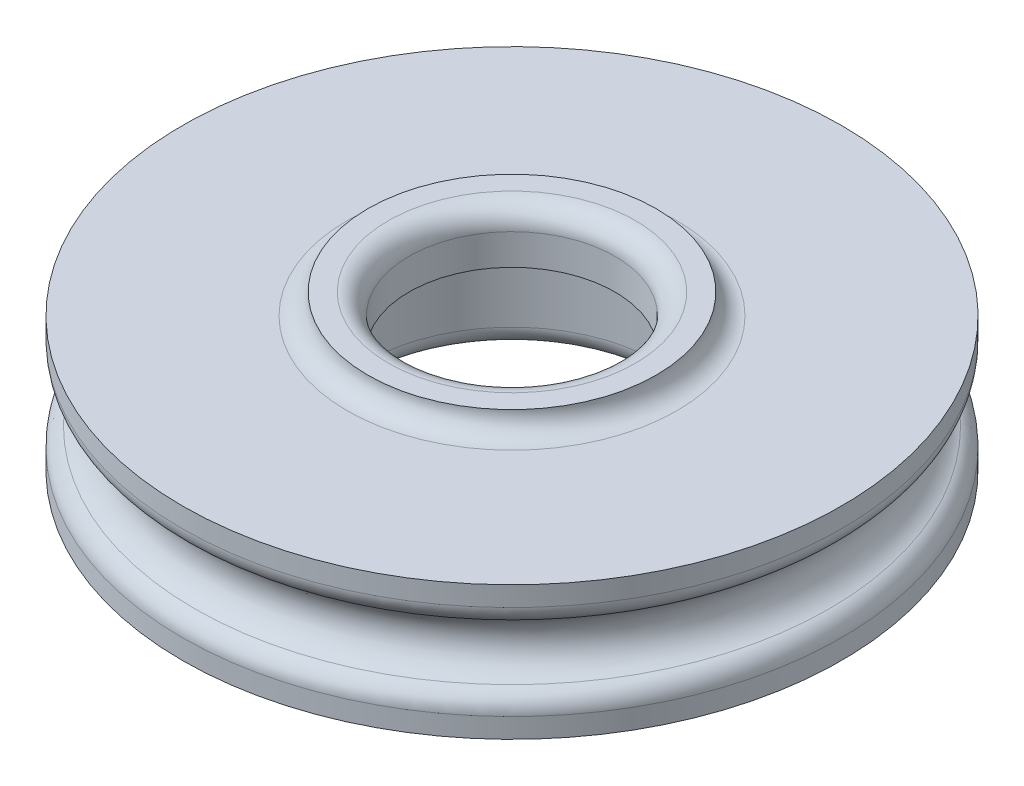
ISO-10303-21;
HEADER;
FILE_DESCRIPTION(('STEP AP214'),'2;1');
FILE_NAME('part.step','',(''),(''),'','','');
FILE_SCHEMA(('AUTOMOTIVE_DESIGN { 1 0 10303 214 1 1 1 1 }'));
ENDSEC;
DATA;
#1=APPLICATION_CONTEXT('core data for automotive mechanical design processes');
#2=APPLICATION_PROTOCOL_DEFINITION('international standard','automotive_design',2000,#1);
#3=PRODUCT_CONTEXT('',#1,'mechanical');
#4=PRODUCT('Part','Part','',(#3));
#5=PRODUCT_RELATED_PRODUCT_CATEGORY('part','',(#4));
#6=PRODUCT_DEFINITION_FORMATION('','',#4);
#7=PRODUCT_DEFINITION_CONTEXT('part definition',#1,'design');
#8=PRODUCT_DEFINITION('design','',#6,#7);
#9=PRODUCT_DEFINITION_SHAPE('','',#8);
#10=(LENGTH_UNIT() NAMED_UNIT(*) SI_UNIT(.MILLI.,.METRE.));
#11=(NAMED_UNIT(*) PLANE_ANGLE_UNIT() SI_UNIT($,.RADIAN.));
#12=(NAMED_UNIT(*) SI_UNIT($,.STERADIAN.) SOLID_ANGLE_UNIT());
#13=UNCERTAINTY_MEASURE_WITH_UNIT(LENGTH_MEASURE(1.E-05),#10,'distance_accuracy_value','');
#14=(GEOMETRIC_REPRESENTATION_CONTEXT(3) GLOBAL_UNCERTAINTY_ASSIGNED_CONTEXT((#13)) GLOBAL_UNIT_ASSIGNED_CONTEXT((#10,
#11,#12)) REPRESENTATION_CONTEXT('',''));
#15=CARTESIAN_POINT('',(0.,0.,0.));
#16=DIRECTION('',(0.,0.,1.));
#17=DIRECTION('',(1.,0.,0.));
#18=AXIS2_PLACEMENT_3D('',#15,#16,#17);
#19=CARTESIAN_POINT('',(0.,1.625,0.));
#20=DIRECTION('',(0.,1.,0.));
#21=DIRECTION('',(0.,0.,1.));
#22=AXIS2_PLACEMENT_3D('',#19,#20,#21);
#23=PLANE('',#22);
#24=CARTESIAN_POINT('',(0.,1.625,0.));
#25=DIRECTION('',(0.,1.,0.));
#26=DIRECTION('',(0.,0.,1.));
#27=AXIS2_PLACEMENT_3D('',#24,#25,#26);
#28=CIRCLE('',#27,4.);
#29=CARTESIAN_POINT('',(0.,1.625,4.));
#30=VERTEX_POINT('',#29);
#31=EDGE_CURVE('E10',#30,#30,#28,.F.);
#32=ORIENTED_EDGE('',*,*,#31,.T.);
#33=EDGE_LOOP('',(#32));
#34=FACE_BOUND('',#33,.T.);
#35=CARTESIAN_POINT('',(0.,1.625,0.));
#36=DIRECTION('',(0.,1.,0.));
#37=DIRECTION('',(0.,0.,1.));
#38=AXIS2_PLACEMENT_3D('',#35,#36,#37);
#39=CIRCLE('',#38,8.);
#40=CARTESIAN_POINT('',(0.,1.625,-8.));
#41=VERTEX_POINT('',#40);
#42=EDGE_CURVE('E77',#41,#41,#39,.T.);
#43=ORIENTED_EDGE('',*,*,#42,.T.);
#44=EDGE_LOOP('',(#43));
#45=FACE_BOUND('',#44,.T.);
#46=ADVANCED_FACE('F36',(#34,#45),#23,.T.);
#47=CARTESIAN_POINT('',(0.,1.625,0.));
#48=DIRECTION('',(0.,-1.,0.));
#49=DIRECTION('',(0.,0.,-1.));
#50=AXIS2_PLACEMENT_3D('',#47,#48,#49);
#51=CYLINDRICAL_SURFACE('',#50,3.55);
#52=CARTESIAN_POINT('',(0.,0.375,0.));
#53=DIRECTION('',(0.,1.,0.));
#54=DIRECTION('',(0.,0.,1.));
#55=AXIS2_PLACEMENT_3D('',#52,#53,#54);
#56=CIRCLE('',#55,3.55);
#57=CARTESIAN_POINT('',(0.,0.375,-3.55));
#58=VERTEX_POINT('',#57);
#59=EDGE_CURVE('E71',#58,#58,#56,.T.);
#60=CARTESIAN_POINT('',(0.,-1.125,0.));
#61=DIRECTION('',(0.,1.,0.));
#62=DIRECTION('',(0.,0.,1.));
#63=AXIS2_PLACEMENT_3D('',#60,#61,#62);
#64=CIRCLE('',#63,3.55);
#65=CARTESIAN_POINT('',(0.,-1.125,-3.55));
#66=VERTEX_POINT('',#65);
#67=EDGE_CURVE('E74',#66,#66,#64,.F.);
#68=CARTESIAN_POINT('',(0.,0.375,-3.55));
#69=CARTESIAN_POINT('',(0.,0.359375,-3.55));
#70=CARTESIAN_POINT('',(0.,0.34375,-3.55));
#71=CARTESIAN_POINT('',(0.,0.3125,-3.55));
#72=CARTESIAN_POINT('',(0.,0.296875,-3.55));
#73=CARTESIAN_POINT('',(0.,0.265625,-3.55));
#74=CARTESIAN_POINT('',(0.,0.25,-3.55));
#75=CARTESIAN_POINT('',(0.,0.21875,-3.55));
#76=CARTESIAN_POINT('',(0.,0.203125,-3.55));
#77=CARTESIAN_POINT('',(0.,0.171875,-3.55));
#78=CARTESIAN_POINT('',(0.,0.15625,-3.55));
#79=CARTESIAN_POINT('',(0.,0.125,-3.55));
#80=CARTESIAN_POINT('',(0.,0.109375,-3.55));
#81=CARTESIAN_POINT('',(0.,0.0781249999999998,-3.55));
#82=CARTESIAN_POINT('',(0.,0.0624999999999998,-3.55));
#83=CARTESIAN_POINT('',(0.,0.0312499999999998,-3.55));
#84=CARTESIAN_POINT('',(0.,0.0156249999999998,-3.55));
#85=CARTESIAN_POINT('',(0.,-0.0156250000000002,-3.55));
#86=CARTESIAN_POINT('',(0.,-0.0312500000000002,-3.55));
#87=CARTESIAN_POINT('',(0.,-0.0625000000000003,-3.55));
#88=CARTESIAN_POINT('',(0.,-0.0781250000000003,-3.55));
#89=CARTESIAN_POINT('',(0.,-0.109375,-3.55));
#90=CARTESIAN_POINT('',(0.,-0.125,-3.55));
#91=CARTESIAN_POINT('',(0.,-0.15625,-3.55));
#92=CARTESIAN_POINT('',(0.,-0.171875,-3.55));
#93=CARTESIAN_POINT('',(0.,-0.203125,-3.55));
#94=CARTESIAN_POINT('',(0.,-0.21875,-3.55));
#95=CARTESIAN_POINT('',(0.,-0.25,-3.55));
#96=CARTESIAN_POINT('',(0.,-0.265625,-3.55));
#97=CARTESIAN_POINT('',(0.,-0.296875,-3.55));
#98=CARTESIAN_POINT('',(0.,-0.3125,-3.55));
#99=CARTESIAN_POINT('',(0.,-0.34375,-3.55));
#100=CARTESIAN_POINT('',(0.,-0.359375,-3.55));
#101=CARTESIAN_POINT('',(0.,-0.390625,-3.55));
#102=CARTESIAN_POINT('',(0.,-0.40625,-3.55));
#103=CARTESIAN_POINT('',(0.,-0.4375,-3.55));
#104=CARTESIAN_POINT('',(0.,-0.453125,-3.55));
#105=CARTESIAN_POINT('',(0.,-0.484375,-3.55));
#106=CARTESIAN_POINT('',(0.,-0.5,-3.55));
#107=CARTESIAN_POINT('',(0.,-0.53125,-3.55));
#108=CARTESIAN_POINT('',(0.,-0.546875,-3.55));
#109=CARTESIAN_POINT('',(0.,-0.578125,-3.55));
#110=CARTESIAN_POINT('',(0.,-0.59375,-3.55));
#111=CARTESIAN_POINT('',(0.,-0.625,-3.55));
#112=CARTESIAN_POINT('',(0.,-0.640625,-3.55));
#113=CARTESIAN_POINT('',(0.,-0.671875,-3.55));
#114=CARTESIAN_POINT('',(0.,-0.6875,-3.55));
#115=CARTESIAN_POINT('',(0.,-0.71875,-3.55));
#116=CARTESIAN_POINT('',(0.,-0.734375,-3.55));
#117=CARTESIAN_POINT('',(0.,-0.765625,-3.55));
#118=CARTESIAN_POINT('',(0.,-0.78125,-3.55));
#119=CARTESIAN_POINT('',(0.,-0.8125,-3.55));
#120=CARTESIAN_POINT('',(0.,-0.828125,-3.55));
#121=CARTESIAN_POINT('',(0.,-0.859375,-3.55));
#122=CARTESIAN_POINT('',(0.,-0.875,-3.55));
#123=CARTESIAN_POINT('',(0.,-0.90625,-3.55));
#124=CARTESIAN_POINT('',(0.,-0.921875,-3.55));
#125=CARTESIAN_POINT('',(0.,-0.953125,-3.55));
#126=CARTESIAN_POINT('',(0.,-0.96875,-3.55));
#127=CARTESIAN_POINT('',(0.,-1.,-3.55));
#128=CARTESIAN_POINT('',(0.,-1.015625,-3.55));
#129=CARTESIAN_POINT('',(0.,-1.046875,-3.55));
#130=CARTESIAN_POINT('',(0.,-1.0625,-3.55));
#131=CARTESIAN_POINT('',(0.,-1.09375,-3.55));
#132=CARTESIAN_POINT('',(0.,-1.109375,-3.55));
#133=CARTESIAN_POINT('',(0.,-1.125,-3.55));
#134=B_SPLINE_CURVE_WITH_KNOTS('',3,(#68,#69,#70,#71,#72,#73,#74,#75,#76,#77,#78,#79,#80,#81,
#82,#83,#84,#85,#86,#87,#88,#89,#90,#91,#92,#93,#94,#95,#96,#97,#98,#99,#100,#101,#102,#103,
#104,#105,#106,#107,#108,#109,#110,#111,#112,#113,#114,#115,#116,#117,#118,#119,#120,#121,#122,
#123,#124,#125,#126,#127,#128,#129,#130,#131,#132,#133),.UNSPECIFIED.,.F.,.F.,(4,2,2,2,2,2,2,2,
2,2,2,2,2,2,2,2,2,2,2,2,2,2,2,2,2,2,2,2,2,2,2,2,4),(0.,0.046875,0.0937500000000001,0.140625,
0.1875,0.234375,0.28125,0.328125,0.375,0.421875,0.46875,0.515625,0.5625,0.609375,0.65625,
0.703125,0.75,0.796875,0.84375,0.890625,0.9375,0.984375,1.03125,1.078125,1.125,1.171875,1.21875,
1.265625,1.3125,1.359375,1.40625,1.453125,1.5),.UNSPECIFIED.);
#135=EDGE_CURVE('BSEAM96',#58,#66,#134,.T.);
#136=ORIENTED_EDGE('',*,*,#59,.T.);
#137=ORIENTED_EDGE('',*,*,#67,.T.);
#138=ORIENTED_EDGE('',*,*,#135,.T.);
#139=ORIENTED_EDGE('',*,*,#135,.F.);
#140=EDGE_LOOP('',(#136,#138,#137,#139));
#141=FACE_BOUND('',#140,.T.);
#142=ADVANCED_FACE('F96',(#141),#51,.F.);
#143=CARTESIAN_POINT('',(0.,1.625,0.));
#144=DIRECTION('',(0.,-1.,0.));
#145=DIRECTION('',(0.,0.,-1.));
#146=AXIS2_PLACEMENT_3D('',#143,#144,#145);
#147=CYLINDRICAL_SURFACE('',#146,8.);
#148=CARTESIAN_POINT('',(0.,1.14564392373896,0.));
#149=DIRECTION('',(0.,-1.,0.));
#150=DIRECTION('',(0.,0.,-1.));
#151=AXIS2_PLACEMENT_3D('',#148,#149,#150);
#152=CIRCLE('',#151,8.);
#153=CARTESIAN_POINT('',(0.,1.14564392373896,-8.));
#154=VERTEX_POINT('',#153);
#155=EDGE_CURVE('E56',#154,#154,#152,.F.);
#156=CARTESIAN_POINT('',(0.,1.14564392373896,-8.));
#157=CARTESIAN_POINT('',(0.,1.15063721620001,-8.));
#158=CARTESIAN_POINT('',(0.,1.15563050866107,-8.));
#159=CARTESIAN_POINT('',(0.,1.16561709358317,-8.));
#160=CARTESIAN_POINT('',(0.,1.17061038604422,-8.));
#161=CARTESIAN_POINT('',(0.,1.18059697096633,-8.));
#162=CARTESIAN_POINT('',(0.,1.18559026342738,-8.));
#163=CARTESIAN_POINT('',(0.,1.19557684834949,-8.));
#164=CARTESIAN_POINT('',(0.,1.20057014081054,-8.));
#165=CARTESIAN_POINT('',(0.,1.21055672573264,-8.));
#166=CARTESIAN_POINT('',(0.,1.2155500181937,-8.));
#167=CARTESIAN_POINT('',(0.,1.2255366031158,-8.));
#168=CARTESIAN_POINT('',(0.,1.23052989557685,-8.));
#169=CARTESIAN_POINT('',(0.,1.24051648049896,-8.));
#170=CARTESIAN_POINT('',(0.,1.24550977296001,-8.));
#171=CARTESIAN_POINT('',(0.,1.25549635788212,-8.));
#172=CARTESIAN_POINT('',(0.,1.26048965034317,-8.));
#173=CARTESIAN_POINT('',(0.,1.27047623526527,-8.));
#174=CARTESIAN_POINT('',(0.,1.27546952772633,-8.));
#175=CARTESIAN_POINT('',(0.,1.28545611264843,-8.));
#176=CARTESIAN_POINT('',(0.,1.29044940510948,-8.));
#177=CARTESIAN_POINT('',(0.,1.30043599003159,-8.));
#178=CARTESIAN_POINT('',(0.,1.30542928249264,-8.));
#179=CARTESIAN_POINT('',(0.,1.31541586741475,-8.));
#180=CARTESIAN_POINT('',(0.,1.3204091598758,-8.));
#181=CARTESIAN_POINT('',(0.,1.3303957447979,-8.));
#182=CARTESIAN_POINT('',(0.,1.33538903725896,-8.));
#183=CARTESIAN_POINT('',(0.,1.34537562218106,-8.));
#184=CARTESIAN_POINT('',(0.,1.35036891464211,-8.));
#185=CARTESIAN_POINT('',(0.,1.36035549956422,-8.));
#186=CARTESIAN_POINT('',(0.,1.36534879202527,-8.));
#187=CARTESIAN_POINT('',(0.,1.37533537694738,-8.));
#188=CARTESIAN_POINT('',(0.,1.38032866940843,-8.));
#189=CARTESIAN_POINT('',(0.,1.39031525433053,-8.));
#190=CARTESIAN_POINT('',(0.,1.39530854679159,-8.));
#191=CARTESIAN_POINT('',(0.,1.40529513171369,-8.));
#192=CARTESIAN_POINT('',(0.,1.41028842417474,-8.));
#193=CARTESIAN_POINT('',(0.,1.42027500909685,-8.));
#194=CARTESIAN_POINT('',(0.,1.4252683015579,-8.));
#195=CARTESIAN_POINT('',(0.,1.43525488648001,-8.));
#196=CARTESIAN_POINT('',(0.,1.44024817894106,-8.));
#197=CARTESIAN_POINT('',(0.,1.45023476386316,-8.));
#198=CARTESIAN_POINT('',(0.,1.45522805632422,-8.));
#199=CARTESIAN_POINT('',(0.,1.46521464124632,-8.));
#200=CARTESIAN_POINT('',(0.,1.47020793370737,-8.));
#201=CARTESIAN_POINT('',(0.,1.48019451862948,-8.));
#202=CARTESIAN_POINT('',(0.,1.48518781109053,-8.));
#203=CARTESIAN_POINT('',(0.,1.49517439601264,-8.));
#204=CARTESIAN_POINT('',(0.,1.50016768847369,-8.));
#205=CARTESIAN_POINT('',(0.,1.51015427339579,-8.));
#206=CARTESIAN_POINT('',(0.,1.51514756585685,-8.));
#207=CARTESIAN_POINT('',(0.,1.52513415077895,-8.));
#208=CARTESIAN_POINT('',(0.,1.53012744324,-8.));
#209=CARTESIAN_POINT('',(0.,1.54011402816211,-8.));
#210=CARTESIAN_POINT('',(0.,1.54510732062316,-8.));
#211=CARTESIAN_POINT('',(0.,1.55509390554527,-8.));
#212=CARTESIAN_POINT('',(0.,1.56008719800632,-8.));
#213=CARTESIAN_POINT('',(0.,1.57007378292842,-8.));
#214=CARTESIAN_POINT('',(0.,1.57506707538947,-8.));
#215=CARTESIAN_POINT('',(0.,1.58505366031158,-8.));
#216=CARTESIAN_POINT('',(0.,1.59004695277263,-8.));
#217=CARTESIAN_POINT('',(0.,1.60003353769474,-8.));
#218=CARTESIAN_POINT('',(0.,1.60502683015579,-8.));
#219=CARTESIAN_POINT('',(0.,1.61501341507789,-8.));
#220=CARTESIAN_POINT('',(0.,1.62000670753895,-8.));
#221=CARTESIAN_POINT('',(0.,1.625,-8.));
#222=B_SPLINE_CURVE_WITH_KNOTS('',3,(#156,#157,#158,#159,#160,#161,#162,#163,#164,#165,#166,
#167,#168,#169,#170,#171,#172,#173,#174,#175,#176,#177,#178,#179,#180,#181,#182,#183,#184,#185,
#186,#187,#188,#189,#190,#191,#192,#193,#194,#195,#196,#197,#198,#199,#200,#201,#202,#203,#204,
#205,#206,#207,#208,#209,#210,#211,#212,#213,#214,#215,#216,#217,#218,#219,#220,#221),
.UNSPECIFIED.,.F.,.F.,(4,2,2,2,2,2,2,2,2,2,2,2,2,2,2,2,2,2,2,2,2,2,2,2,2,2,2,2,2,2,2,2,4),(0.,
0.0149798773831573,0.0299597547663147,0.0449396321494722,0.0599195095326297,0.0748993869157872,
0.0898792642989447,0.104859141682102,0.119839019065259,0.134818896448417,0.149798773831574,
0.164778651214732,0.179758528597889,0.194738405981047,0.209718283364204,0.224698160747362,
0.239678038130519,0.254657915513676,0.269637792896834,0.284617670279991,0.299597547663149,
0.314577425046306,0.329557302429464,0.344537179812621,0.359517057195778,0.374496934578936,
0.389476811962093,0.404456689345251,0.419436566728408,0.434416444111566,0.449396321494723,
0.464376198877881,0.479356076261038),.UNSPECIFIED.);
#223=EDGE_CURVE('BSEAM99',#154,#41,#222,.T.);
#224=ORIENTED_EDGE('',*,*,#155,.T.);
#225=ORIENTED_EDGE('',*,*,#42,.F.);
#226=ORIENTED_EDGE('',*,*,#223,.T.);
#227=ORIENTED_EDGE('',*,*,#223,.F.);
#228=EDGE_LOOP('',(#224,#226,#225,#227));
#229=FACE_BOUND('',#228,.T.);
#230=ADVANCED_FACE('F99',(#229),#147,.T.);
#231=CARTESIAN_POINT('',(0.,-1.625,0.));
#232=DIRECTION('',(0.,1.,0.));
#233=DIRECTION('',(0.,0.,1.));
#234=AXIS2_PLACEMENT_3D('',#231,#232,#233);
#235=PLANE('',#234);
#236=CARTESIAN_POINT('',(0.,-1.625,0.));
#237=DIRECTION('',(0.,1.,0.));
#238=DIRECTION('',(0.,0.,1.));
#239=AXIS2_PLACEMENT_3D('',#236,#237,#238);
#240=CIRCLE('',#239,4.05);
#241=CARTESIAN_POINT('',(0.,-1.625,4.05));
#242=VERTEX_POINT('',#241);
#243=EDGE_CURVE('E65',#242,#242,#240,.T.);
#244=ORIENTED_EDGE('',*,*,#243,.T.);
#245=EDGE_LOOP('',(#244));
#246=FACE_BOUND('',#245,.T.);
#247=CARTESIAN_POINT('',(0.,-1.625,0.));
#248=DIRECTION('',(0.,1.,0.));
#249=DIRECTION('',(0.,0.,1.));
#250=AXIS2_PLACEMENT_3D('',#247,#248,#249);
#251=CIRCLE('',#250,8.);
#252=CARTESIAN_POINT('',(0.,-1.625,-8.));
#253=VERTEX_POINT('',#252);
#254=EDGE_CURVE('E78',#253,#253,#251,.T.);
#255=ORIENTED_EDGE('',*,*,#254,.F.);
#256=EDGE_LOOP('',(#255));
#257=FACE_BOUND('',#256,.T.);
#258=ADVANCED_FACE('F103',(#246,#257),#235,.F.);
#259=CARTESIAN_POINT('',(0.,-1.14564392373896,0.));
#260=DIRECTION('',(0.,-1.,0.));
#261=DIRECTION('',(0.,0.,-1.));
#262=AXIS2_PLACEMENT_3D('',#259,#260,#261);
#263=CIRCLE('',#262,8.);
#264=CARTESIAN_POINT('',(0.,-1.14564392373896,-8.));
#265=VERTEX_POINT('',#264);
#266=EDGE_CURVE('E43',#265,#265,#263,.T.);
#267=CARTESIAN_POINT('',(0.,-1.14564392373896,-8.));
#268=CARTESIAN_POINT('',(0.,-1.15063721620001,-8.));
#269=CARTESIAN_POINT('',(0.,-1.15563050866107,-8.));
#270=CARTESIAN_POINT('',(0.,-1.16561709358317,-8.));
#271=CARTESIAN_POINT('',(0.,-1.17061038604422,-8.));
#272=CARTESIAN_POINT('',(0.,-1.18059697096633,-8.));
#273=CARTESIAN_POINT('',(0.,-1.18559026342738,-8.));
#274=CARTESIAN_POINT('',(0.,-1.19557684834949,-8.));
#275=CARTESIAN_POINT('',(0.,-1.20057014081054,-8.));
#276=CARTESIAN_POINT('',(0.,-1.21055672573264,-8.));
#277=CARTESIAN_POINT('',(0.,-1.2155500181937,-8.));
#278=CARTESIAN_POINT('',(0.,-1.2255366031158,-8.));
#279=CARTESIAN_POINT('',(0.,-1.23052989557685,-8.));
#280=CARTESIAN_POINT('',(0.,-1.24051648049896,-8.));
#281=CARTESIAN_POINT('',(0.,-1.24550977296001,-8.));
#282=CARTESIAN_POINT('',(0.,-1.25549635788212,-8.));
#283=CARTESIAN_POINT('',(0.,-1.26048965034317,-8.));
#284=CARTESIAN_POINT('',(0.,-1.27047623526527,-8.));
#285=CARTESIAN_POINT('',(0.,-1.27546952772633,-8.));
#286=CARTESIAN_POINT('',(0.,-1.28545611264843,-8.));
#287=CARTESIAN_POINT('',(0.,-1.29044940510948,-8.));
#288=CARTESIAN_POINT('',(0.,-1.30043599003159,-8.));
#289=CARTESIAN_POINT('',(0.,-1.30542928249264,-8.));
#290=CARTESIAN_POINT('',(0.,-1.31541586741475,-8.));
#291=CARTESIAN_POINT('',(0.,-1.3204091598758,-8.));
#292=CARTESIAN_POINT('',(0.,-1.3303957447979,-8.));
#293=CARTESIAN_POINT('',(0.,-1.33538903725896,-8.));
#294=CARTESIAN_POINT('',(0.,-1.34537562218106,-8.));
#295=CARTESIAN_POINT('',(0.,-1.35036891464211,-8.));
#296=CARTESIAN_POINT('',(0.,-1.36035549956422,-8.));
#297=CARTESIAN_POINT('',(0.,-1.36534879202527,-8.));
#298=CARTESIAN_POINT('',(0.,-1.37533537694738,-8.));
#299=CARTESIAN_POINT('',(0.,-1.38032866940843,-8.));
#300=CARTESIAN_POINT('',(0.,-1.39031525433053,-8.));
#301=CARTESIAN_POINT('',(0.,-1.39530854679159,-8.));
#302=CARTESIAN_POINT('',(0.,-1.40529513171369,-8.));
#303=CARTESIAN_POINT('',(0.,-1.41028842417474,-8.));
#304=CARTESIAN_POINT('',(0.,-1.42027500909685,-8.));
#305=CARTESIAN_POINT('',(0.,-1.4252683015579,-8.));
#306=CARTESIAN_POINT('',(0.,-1.43525488648001,-8.));
#307=CARTESIAN_POINT('',(0.,-1.44024817894106,-8.));
#308=CARTESIAN_POINT('',(0.,-1.45023476386316,-8.));
#309=CARTESIAN_POINT('',(0.,-1.45522805632422,-8.));
#310=CARTESIAN_POINT('',(0.,-1.46521464124632,-8.));
#311=CARTESIAN_POINT('',(0.,-1.47020793370737,-8.));
#312=CARTESIAN_POINT('',(0.,-1.48019451862948,-8.));
#313=CARTESIAN_POINT('',(0.,-1.48518781109053,-8.));
#314=CARTESIAN_POINT('',(0.,-1.49517439601264,-8.));
#315=CARTESIAN_POINT('',(0.,-1.50016768847369,-8.));
#316=CARTESIAN_POINT('',(0.,-1.51015427339579,-8.));
#317=CARTESIAN_POINT('',(0.,-1.51514756585684,-8.));
#318=CARTESIAN_POINT('',(0.,-1.52513415077895,-8.));
#319=CARTESIAN_POINT('',(0.,-1.53012744324,-8.));
#320=CARTESIAN_POINT('',(0.,-1.54011402816211,-8.));
#321=CARTESIAN_POINT('',(0.,-1.54510732062316,-8.));
#322=CARTESIAN_POINT('',(0.,-1.55509390554527,-8.));
#323=CARTESIAN_POINT('',(0.,-1.56008719800632,-8.));
#324=CARTESIAN_POINT('',(0.,-1.57007378292842,-8.));
#325=CARTESIAN_POINT('',(0.,-1.57506707538947,-8.));
#326=CARTESIAN_POINT('',(0.,-1.58505366031158,-8.));
#327=CARTESIAN_POINT('',(0.,-1.59004695277263,-8.));
#328=CARTESIAN_POINT('',(0.,-1.60003353769474,-8.));
#329=CARTESIAN_POINT('',(0.,-1.60502683015579,-8.));
#330=CARTESIAN_POINT('',(0.,-1.61501341507789,-8.));
#331=CARTESIAN_POINT('',(0.,-1.62000670753895,-8.));
#332=CARTESIAN_POINT('',(0.,-1.625,-8.));
#333=B_SPLINE_CURVE_WITH_KNOTS('',3,(#267,#268,#269,#270,#271,#272,#273,#274,#275,#276,#277,
#278,#279,#280,#281,#282,#283,#284,#285,#286,#287,#288,#289,#290,#291,#292,#293,#294,#295,#296,
#297,#298,#299,#300,#301,#302,#303,#304,#305,#306,#307,#308,#309,#310,#311,#312,#313,#314,#315,
#316,#317,#318,#319,#320,#321,#322,#323,#324,#325,#326,#327,#328,#329,#330,#331,#332),
.UNSPECIFIED.,.F.,.F.,(4,2,2,2,2,2,2,2,2,2,2,2,2,2,2,2,2,2,2,2,2,2,2,2,2,2,2,2,2,2,2,2,4),(0.,
0.0149798773831575,0.029959754766315,0.0449396321494724,0.0599195095326299,0.0748993869157874,
0.0898792642989449,0.104859141682102,0.11983901906526,0.134818896448417,0.149798773831574,
0.164778651214732,0.179758528597889,0.194738405981047,0.209718283364204,0.224698160747362,
0.239678038130519,0.254657915513677,0.269637792896834,0.284617670279992,0.299597547663149,
0.314577425046307,0.329557302429464,0.344537179812621,0.359517057195779,0.374496934578936,
0.389476811962094,0.404456689345251,0.419436566728409,0.434416444111566,0.449396321494724,
0.464376198877881,0.479356076261038),.UNSPECIFIED.);
#334=EDGE_CURVE('BSEAM93',#265,#253,#333,.T.);
#335=ORIENTED_EDGE('',*,*,#266,.T.);
#336=ORIENTED_EDGE('',*,*,#254,.T.);
#337=ORIENTED_EDGE('',*,*,#334,.T.);
#338=ORIENTED_EDGE('',*,*,#334,.F.);
#339=EDGE_LOOP('',(#335,#337,#336,#338));
#340=FACE_BOUND('',#339,.T.);
#341=ADVANCED_FACE('F93',(#340),#147,.T.);
#342=CARTESIAN_POINT('',(0.,0.,8.));
#343=DIRECTION('',(1.,0.,0.));
#344=DIRECTION('',(0.,0.,-1.));
#345=AXIS2_PLACEMENT_3D('',#342,#343,#344);
#346=ELLIPSE('',#345,0.750000000000001,0.75);
#347=CARTESIAN_POINT('',(0.,1.625,0.));
#348=DIRECTION('',(0.,1.,0.));
#349=AXIS1_PLACEMENT('',#347,#348);
#350=SURFACE_OF_REVOLUTION('',#346,#349);
#351=CARTESIAN_POINT('',(0.,0.687386354243377,0.));
#352=DIRECTION('',(0.,1.,0.));
#353=DIRECTION('',(0.,0.,1.));
#354=AXIS2_PLACEMENT_3D('',#351,#352,#353);
#355=CIRCLE('',#354,7.7);
#356=CARTESIAN_POINT('',(0.,0.687386354243377,7.7));
#357=VERTEX_POINT('',#356);
#358=EDGE_CURVE('E47',#357,#357,#355,.F.);
#359=ORIENTED_EDGE('',*,*,#358,.T.);
#360=EDGE_LOOP('',(#359));
#361=FACE_BOUND('',#360,.T.);
#362=CARTESIAN_POINT('',(0.,-0.687386354243376,0.));
#363=DIRECTION('',(0.,1.,0.));
#364=DIRECTION('',(0.,0.,1.));
#365=AXIS2_PLACEMENT_3D('',#362,#363,#364);
#366=CIRCLE('',#365,7.7);
#367=CARTESIAN_POINT('',(0.,-0.687386354243376,7.7));
#368=VERTEX_POINT('',#367);
#369=EDGE_CURVE('E51',#368,#368,#366,.T.);
#370=ORIENTED_EDGE('',*,*,#369,.T.);
#371=EDGE_LOOP('',(#370));
#372=FACE_BOUND('',#371,.T.);
#373=ADVANCED_FACE('F88',(#361,#372),#350,.T.);
#374=CARTESIAN_POINT('',(0.,0.875,0.));
#375=DIRECTION('',(0.,1.,0.));
#376=DIRECTION('',(0.,0.,1.));
#377=AXIS2_PLACEMENT_3D('',#374,#375,#376);
#378=PLANE('',#377);
#379=CARTESIAN_POINT('',(0.,0.875,0.));
#380=DIRECTION('',(0.,1.,0.));
#381=DIRECTION('',(0.,0.,1.));
#382=AXIS2_PLACEMENT_3D('',#379,#380,#381);
#383=CIRCLE('',#382,3.05);
#384=CARTESIAN_POINT('',(0.,0.875,3.05));
#385=VERTEX_POINT('',#384);
#386=EDGE_CURVE('E68',#385,#385,#383,.F.);
#387=ORIENTED_EDGE('',*,*,#386,.T.);
#388=EDGE_LOOP('',(#387));
#389=FACE_BOUND('',#388,.T.);
#390=CARTESIAN_POINT('',(0.,0.875,0.));
#391=DIRECTION('',(0.,1.,0.));
#392=DIRECTION('',(0.,0.,1.));
#393=AXIS2_PLACEMENT_3D('',#390,#391,#392);
#394=CIRCLE('',#393,2.5);
#395=CARTESIAN_POINT('',(0.,0.875,2.5));
#396=VERTEX_POINT('',#395);
#397=EDGE_CURVE('E81',#396,#396,#394,.T.);
#398=ORIENTED_EDGE('',*,*,#397,.T.);
#399=EDGE_LOOP('',(#398));
#400=FACE_BOUND('',#399,.T.);
#401=ADVANCED_FACE('F92',(#389,#400),#378,.F.);
#402=CARTESIAN_POINT('',(0.,0.875,0.));
#403=DIRECTION('',(0.,1.,0.));
#404=DIRECTION('',(0.,0.,1.));
#405=AXIS2_PLACEMENT_3D('',#402,#403,#404);
#406=CYLINDRICAL_SURFACE('',#405,2.5);
#407=CARTESIAN_POINT('',(0.,1.625,0.));
#408=DIRECTION('',(0.,1.,0.));
#409=DIRECTION('',(0.,0.,1.));
#410=AXIS2_PLACEMENT_3D('',#407,#408,#409);
#411=CIRCLE('',#410,2.5);
#412=CARTESIAN_POINT('',(0.,1.625,2.5));
#413=VERTEX_POINT('',#412);
#414=EDGE_CURVE('E62',#413,#413,#411,.T.);
#415=ORIENTED_EDGE('',*,*,#414,.T.);
#416=EDGE_LOOP('',(#415));
#417=FACE_BOUND('',#416,.T.);
#418=ORIENTED_EDGE('',*,*,#397,.F.);
#419=EDGE_LOOP('',(#418));
#420=FACE_BOUND('',#419,.T.);
#421=ADVANCED_FACE('F146',(#417,#420),#406,.F.);
#422=CARTESIAN_POINT('',(0.,2.125,0.));
#423=DIRECTION('',(0.,1.,0.));
#424=DIRECTION('',(0.,0.,1.));
#425=AXIS2_PLACEMENT_3D('',#422,#423,#424);
#426=PLANE('',#425);
#427=CARTESIAN_POINT('',(0.,2.125,0.));
#428=DIRECTION('',(0.,1.,0.));
#429=DIRECTION('',(0.,0.,1.));
#430=AXIS2_PLACEMENT_3D('',#427,#428,#429);
#431=CIRCLE('',#430,3.);
#432=CARTESIAN_POINT('',(0.,2.125,3.));
#433=VERTEX_POINT('',#432);
#434=EDGE_CURVE('E59',#433,#433,#431,.F.);
#435=ORIENTED_EDGE('',*,*,#434,.T.);
#436=EDGE_LOOP('',(#435));
#437=FACE_BOUND('',#436,.T.);
#438=CARTESIAN_POINT('',(0.,2.125,0.));
#439=DIRECTION('',(0.,1.,0.));
#440=DIRECTION('',(0.,0.,1.));
#441=AXIS2_PLACEMENT_3D('',#438,#439,#440);
#442=CIRCLE('',#441,3.5);
#443=CARTESIAN_POINT('',(0.,2.125,3.5));
#444=VERTEX_POINT('',#443);
#445=EDGE_CURVE('E140',#444,#444,#442,.T.);
#446=ORIENTED_EDGE('',*,*,#445,.T.);
#447=EDGE_LOOP('',(#446));
#448=FACE_BOUND('',#447,.T.);
#449=ADVANCED_FACE('F113',(#437,#448),#426,.T.);
#450=CARTESIAN_POINT('',(0.,0.375,0.));
#451=DIRECTION('',(0.,1.,0.));
#452=DIRECTION('',(0.,0.,1.));
#453=AXIS2_PLACEMENT_3D('',#450,#451,#452);
#454=TOROIDAL_SURFACE('',#453,3.05,0.5);
#455=ORIENTED_EDGE('',*,*,#386,.F.);
#456=EDGE_LOOP('',(#455));
#457=FACE_BOUND('',#456,.T.);
#458=ORIENTED_EDGE('',*,*,#59,.F.);
#459=EDGE_LOOP('',(#458));
#460=FACE_BOUND('',#459,.T.);
#461=ADVANCED_FACE('F109',(#457,#460),#454,.F.);
#462=CARTESIAN_POINT('',(0.,-1.125,0.));
#463=DIRECTION('',(0.,1.,0.));
#464=DIRECTION('',(0.,0.,1.));
#465=AXIS2_PLACEMENT_3D('',#462,#463,#464);
#466=TOROIDAL_SURFACE('',#465,4.05,0.5);
#467=ORIENTED_EDGE('',*,*,#67,.F.);
#468=EDGE_LOOP('',(#467));
#469=FACE_BOUND('',#468,.T.);
#470=ORIENTED_EDGE('',*,*,#243,.F.);
#471=EDGE_LOOP('',(#470));
#472=FACE_BOUND('',#471,.T.);
#473=ADVANCED_FACE('F112',(#469,#472),#466,.T.);
#474=CARTESIAN_POINT('',(0.,1.625,0.));
#475=DIRECTION('',(0.,1.,0.));
#476=DIRECTION('',(0.,0.,1.));
#477=AXIS2_PLACEMENT_3D('',#474,#475,#476);
#478=TOROIDAL_SURFACE('',#477,3.,0.5);
#479=ORIENTED_EDGE('',*,*,#434,.F.);
#480=EDGE_LOOP('',(#479));
#481=FACE_BOUND('',#480,.T.);
#482=ORIENTED_EDGE('',*,*,#414,.F.);
#483=EDGE_LOOP('',(#482));
#484=FACE_BOUND('',#483,.T.);
#485=ADVANCED_FACE('F117',(#481,#484),#478,.T.);
#486=CARTESIAN_POINT('',(0.,1.14564392373896,0.));
#487=DIRECTION('',(0.,-1.,0.));
#488=DIRECTION('',(0.,0.,-1.));
#489=AXIS2_PLACEMENT_3D('',#486,#487,#488);
#490=TOROIDAL_SURFACE('',#489,7.5,0.5);
#491=ORIENTED_EDGE('',*,*,#358,.F.);
#492=EDGE_LOOP('',(#491));
#493=FACE_BOUND('',#492,.T.);
#494=ORIENTED_EDGE('',*,*,#155,.F.);
#495=EDGE_LOOP('',(#494));
#496=FACE_BOUND('',#495,.T.);
#497=ADVANCED_FACE('F121',(#493,#496),#490,.T.);
#498=CARTESIAN_POINT('',(0.,-1.14564392373896,0.));
#499=DIRECTION('',(0.,-1.,0.));
#500=DIRECTION('',(0.,0.,-1.));
#501=AXIS2_PLACEMENT_3D('',#498,#499,#500);
#502=TOROIDAL_SURFACE('',#501,7.5,0.5);
#503=ORIENTED_EDGE('',*,*,#266,.F.);
#504=EDGE_LOOP('',(#503));
#505=FACE_BOUND('',#504,.T.);
#506=ORIENTED_EDGE('',*,*,#369,.F.);
#507=EDGE_LOOP('',(#506));
#508=FACE_BOUND('',#507,.T.);
#509=ADVANCED_FACE('F124',(#505,#508),#502,.T.);
#510=CARTESIAN_POINT('',(0.,2.125,0.));
#511=DIRECTION('',(0.,1.,0.));
#512=DIRECTION('',(0.,0.,1.));
#513=AXIS2_PLACEMENT_3D('',#510,#511,#512);
#514=TOROIDAL_SURFACE('',#513,4.,0.5);
#515=ORIENTED_EDGE('',*,*,#31,.F.);
#516=EDGE_LOOP('',(#515));
#517=FACE_BOUND('',#516,.T.);
#518=ORIENTED_EDGE('',*,*,#445,.F.);
#519=EDGE_LOOP('',(#518));
#520=FACE_BOUND('',#519,.T.);
#521=ADVANCED_FACE('F38',(#517,#520),#514,.F.);
#522=CLOSED_SHELL('',(#46,#142,#230,#258,#341,#373,#401,#421,#449,#461,#473,#485,#497,#509,#521));
#523=MANIFOLD_SOLID_BREP('B2',#522);
#524=ADVANCED_BREP_SHAPE_REPRESENTATION('',(#18,#523),#14);
#525=SHAPE_DEFINITION_REPRESENTATION(#9,#524);
ENDSEC;
END-ISO-10303-21;
